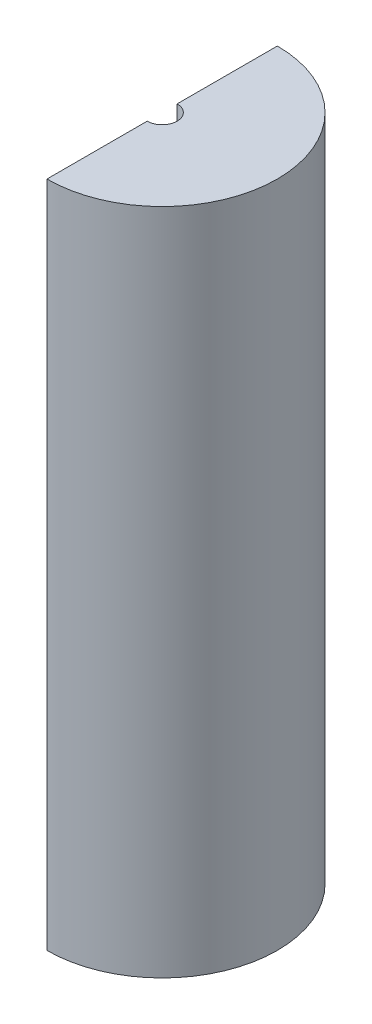
ISO-10303-21;
HEADER;
FILE_DESCRIPTION(('STEP AP214'),'2;1');
FILE_NAME('part.step','',(''),(''),'','','');
FILE_SCHEMA(('AUTOMOTIVE_DESIGN { 1 0 10303 214 1 1 1 1 }'));
ENDSEC;
DATA;
#1=APPLICATION_CONTEXT('core data for automotive mechanical design processes');
#2=APPLICATION_PROTOCOL_DEFINITION('international standard','automotive_design',2000,#1);
#3=PRODUCT_CONTEXT('',#1,'mechanical');
#4=PRODUCT('Part','Part','',(#3));
#5=PRODUCT_RELATED_PRODUCT_CATEGORY('part','',(#4));
#6=PRODUCT_DEFINITION_FORMATION('','',#4);
#7=PRODUCT_DEFINITION_CONTEXT('part definition',#1,'design');
#8=PRODUCT_DEFINITION('design','',#6,#7);
#9=PRODUCT_DEFINITION_SHAPE('','',#8);
#10=(LENGTH_UNIT() NAMED_UNIT(*) SI_UNIT(.MILLI.,.METRE.));
#11=(NAMED_UNIT(*) PLANE_ANGLE_UNIT() SI_UNIT($,.RADIAN.));
#12=(NAMED_UNIT(*) SI_UNIT($,.STERADIAN.) SOLID_ANGLE_UNIT());
#13=UNCERTAINTY_MEASURE_WITH_UNIT(LENGTH_MEASURE(1.E-05),#10,'distance_accuracy_value','');
#14=(GEOMETRIC_REPRESENTATION_CONTEXT(3) GLOBAL_UNCERTAINTY_ASSIGNED_CONTEXT((#13)) GLOBAL_UNIT_ASSIGNED_CONTEXT((#10,
#11,#12)) REPRESENTATION_CONTEXT('',''));
#15=CARTESIAN_POINT('',(0.,0.,0.));
#16=DIRECTION('',(0.,0.,1.));
#17=DIRECTION('',(1.,0.,0.));
#18=AXIS2_PLACEMENT_3D('',#15,#16,#17);
#19=CARTESIAN_POINT('',(0.,2.,-0.344895788082818));
#20=DIRECTION('',(0.,-1.,0.));
#21=DIRECTION('',(0.,0.,-1.));
#22=AXIS2_PLACEMENT_3D('',#19,#20,#21);
#23=CYLINDRICAL_SURFACE('',#22,0.344895788082818);
#24=CARTESIAN_POINT('',(0.,0.,-0.344895788082818));
#25=DIRECTION('',(0.,1.,0.));
#26=DIRECTION('',(0.,0.,1.));
#27=AXIS2_PLACEMENT_3D('',#24,#25,#26);
#28=CIRCLE('',#27,0.344895788082818);
#29=CARTESIAN_POINT('',(0.,0.,0.));
#30=VERTEX_POINT('',#29);
#31=CARTESIAN_POINT('',(0.,0.,-0.689791576165636));
#32=VERTEX_POINT('',#31);
#33=EDGE_CURVE('E118',#30,#32,#28,.T.);
#34=ORIENTED_EDGE('',*,*,#33,.T.);
#35=DIRECTION('',(0.,-1.,0.));
#36=VECTOR('',#35,1.);
#37=CARTESIAN_POINT('',(0.,2.,-0.689791576165636));
#38=LINE('',#37,#36);
#39=CARTESIAN_POINT('',(0.,2.,-0.689791576165636));
#40=VERTEX_POINT('',#39);
#41=EDGE_CURVE('E11',#40,#32,#38,.T.);
#42=ORIENTED_EDGE('',*,*,#41,.F.);
#43=CARTESIAN_POINT('',(0.,2.,-0.344895788082818));
#44=DIRECTION('',(0.,1.,0.));
#45=DIRECTION('',(0.,0.,1.));
#46=AXIS2_PLACEMENT_3D('',#43,#44,#45);
#47=CIRCLE('',#46,0.344895788082818);
#48=CARTESIAN_POINT('',(0.,2.,0.));
#49=VERTEX_POINT('',#48);
#50=EDGE_CURVE('E101',#49,#40,#47,.T.);
#51=ORIENTED_EDGE('',*,*,#50,.F.);
#52=DIRECTION('',(0.,-1.,0.));
#53=VECTOR('',#52,1.);
#54=CARTESIAN_POINT('',(0.,2.,0.));
#55=LINE('',#54,#53);
#56=EDGE_CURVE('E114',#49,#30,#55,.T.);
#57=ORIENTED_EDGE('',*,*,#56,.T.);
#58=EDGE_LOOP('',(#34,#42,#51,#57));
#59=FACE_BOUND('',#58,.T.);
#60=ADVANCED_FACE('F41',(#59),#23,.T.);
#61=CARTESIAN_POINT('',(0.,2.,-0.389791576165636));
#62=DIRECTION('',(1.,0.,0.));
#63=DIRECTION('',(0.,0.,-1.));
#64=AXIS2_PLACEMENT_3D('',#61,#62,#63);
#65=PLANE('',#64);
#66=DIRECTION('',(0.,0.,1.));
#67=VECTOR('',#66,1.);
#68=CARTESIAN_POINT('',(0.,0.,-0.389791576165636));
#69=LINE('',#68,#67);
#70=CARTESIAN_POINT('',(0.,0.,-0.389791576165636));
#71=VERTEX_POINT('',#70);
#72=EDGE_CURVE('E106',#32,#71,#69,.T.);
#73=ORIENTED_EDGE('',*,*,#72,.T.);
#74=DIRECTION('',(0.,-1.,0.));
#75=VECTOR('',#74,1.);
#76=CARTESIAN_POINT('',(0.,2.,-0.389791576165636));
#77=LINE('',#76,#75);
#78=CARTESIAN_POINT('',(0.,2.,-0.389791576165636));
#79=VERTEX_POINT('',#78);
#80=EDGE_CURVE('E50',#79,#71,#77,.T.);
#81=ORIENTED_EDGE('',*,*,#80,.F.);
#82=DIRECTION('',(0.,0.,1.));
#83=VECTOR('',#82,1.);
#84=CARTESIAN_POINT('',(0.,2.,-0.389791576165636));
#85=LINE('',#84,#83);
#86=EDGE_CURVE('E96',#40,#79,#85,.T.);
#87=ORIENTED_EDGE('',*,*,#86,.F.);
#88=ORIENTED_EDGE('',*,*,#41,.T.);
#89=EDGE_LOOP('',(#73,#81,#87,#88));
#90=FACE_BOUND('',#89,.T.);
#91=ADVANCED_FACE('F105',(#90),#65,.F.);
#92=CARTESIAN_POINT('',(0.,2.,-0.344895788082818));
#93=DIRECTION('',(0.,-1.,0.));
#94=DIRECTION('',(0.,0.,-1.));
#95=AXIS2_PLACEMENT_3D('',#92,#93,#94);
#96=CYLINDRICAL_SURFACE('',#95,0.0448957880828179);
#97=CARTESIAN_POINT('',(0.,0.,-0.344895788082818));
#98=DIRECTION('',(0.,-1.,0.));
#99=DIRECTION('',(0.,0.,1.));
#100=AXIS2_PLACEMENT_3D('',#97,#98,#99);
#101=CIRCLE('',#100,0.0448957880828179);
#102=CARTESIAN_POINT('',(0.,0.,-0.3));
#103=VERTEX_POINT('',#102);
#104=EDGE_CURVE('E82',#71,#103,#101,.T.);
#105=ORIENTED_EDGE('',*,*,#104,.T.);
#106=DIRECTION('',(0.,-1.,0.));
#107=VECTOR('',#106,1.);
#108=CARTESIAN_POINT('',(0.,2.,-0.3));
#109=LINE('',#108,#107);
#110=CARTESIAN_POINT('',(0.,2.,-0.3));
#111=VERTEX_POINT('',#110);
#112=EDGE_CURVE('E108',#111,#103,#109,.T.);
#113=ORIENTED_EDGE('',*,*,#112,.F.);
#114=CARTESIAN_POINT('',(0.,2.,-0.344895788082818));
#115=DIRECTION('',(0.,-1.,0.));
#116=DIRECTION('',(0.,0.,1.));
#117=AXIS2_PLACEMENT_3D('',#114,#115,#116);
#118=CIRCLE('',#117,0.0448957880828179);
#119=EDGE_CURVE('E99',#79,#111,#118,.T.);
#120=ORIENTED_EDGE('',*,*,#119,.F.);
#121=ORIENTED_EDGE('',*,*,#80,.T.);
#122=EDGE_LOOP('',(#105,#113,#120,#121));
#123=FACE_BOUND('',#122,.T.);
#124=ADVANCED_FACE('F109',(#123),#96,.F.);
#125=CARTESIAN_POINT('',(0.,2.,0.));
#126=DIRECTION('',(1.,0.,0.));
#127=DIRECTION('',(0.,0.,-1.));
#128=AXIS2_PLACEMENT_3D('',#125,#126,#127);
#129=PLANE('',#128);
#130=DIRECTION('',(0.,0.,1.));
#131=VECTOR('',#130,1.);
#132=CARTESIAN_POINT('',(0.,0.,0.));
#133=LINE('',#132,#131);
#134=EDGE_CURVE('E89',#103,#30,#133,.T.);
#135=ORIENTED_EDGE('',*,*,#134,.T.);
#136=ORIENTED_EDGE('',*,*,#56,.F.);
#137=DIRECTION('',(0.,0.,1.));
#138=VECTOR('',#137,1.);
#139=CARTESIAN_POINT('',(0.,2.,0.));
#140=LINE('',#139,#138);
#141=EDGE_CURVE('E61',#111,#49,#140,.T.);
#142=ORIENTED_EDGE('',*,*,#141,.F.);
#143=ORIENTED_EDGE('',*,*,#112,.T.);
#144=EDGE_LOOP('',(#135,#136,#142,#143));
#145=FACE_BOUND('',#144,.T.);
#146=ADVANCED_FACE('F131',(#145),#129,.F.);
#147=CARTESIAN_POINT('',(0.,2.,-0.344895788082818));
#148=DIRECTION('',(0.,1.,0.));
#149=DIRECTION('',(0.,0.,1.));
#150=AXIS2_PLACEMENT_3D('',#147,#148,#149);
#151=PLANE('',#150);
#152=ORIENTED_EDGE('',*,*,#50,.T.);
#153=ORIENTED_EDGE('',*,*,#86,.T.);
#154=ORIENTED_EDGE('',*,*,#119,.T.);
#155=ORIENTED_EDGE('',*,*,#141,.T.);
#156=EDGE_LOOP('',(#152,#153,#154,#155));
#157=FACE_BOUND('',#156,.T.);
#158=ADVANCED_FACE('F97',(#157),#151,.T.);
#159=CARTESIAN_POINT('',(0.,0.,-0.344895788082818));
#160=DIRECTION('',(0.,1.,0.));
#161=DIRECTION('',(0.,0.,1.));
#162=AXIS2_PLACEMENT_3D('',#159,#160,#161);
#163=PLANE('',#162);
#164=ORIENTED_EDGE('',*,*,#33,.F.);
#165=ORIENTED_EDGE('',*,*,#134,.F.);
#166=ORIENTED_EDGE('',*,*,#104,.F.);
#167=ORIENTED_EDGE('',*,*,#72,.F.);
#168=EDGE_LOOP('',(#164,#165,#166,#167));
#169=FACE_BOUND('',#168,.T.);
#170=ADVANCED_FACE('F134',(#169),#163,.F.);
#171=CLOSED_SHELL('',(#60,#91,#124,#146,#158,#170));
#172=MANIFOLD_SOLID_BREP('B2',#171);
#173=ADVANCED_BREP_SHAPE_REPRESENTATION('',(#18,#172),#14);
#174=SHAPE_DEFINITION_REPRESENTATION(#9,#173);
ENDSEC;
END-ISO-10303-21;
